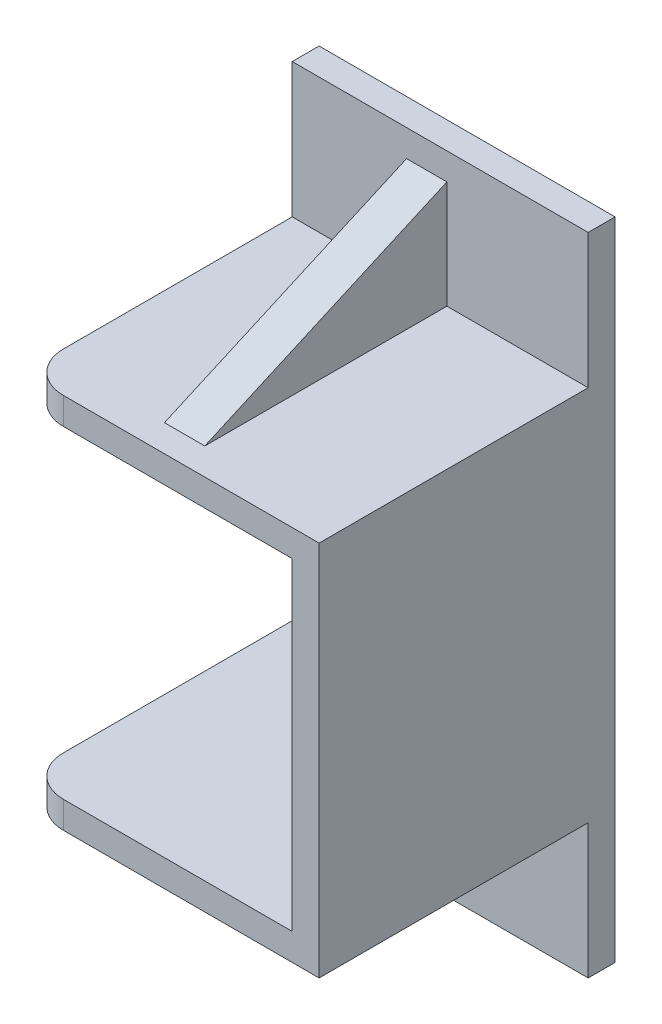
ISO-10303-21;
HEADER;
FILE_DESCRIPTION(('STEP AP214'),'2;1');
FILE_NAME('part.step','',(''),(''),'','','');
FILE_SCHEMA(('AUTOMOTIVE_DESIGN { 1 0 10303 214 1 1 1 1 }'));
ENDSEC;
DATA;
#1=APPLICATION_CONTEXT('core data for automotive mechanical design processes');
#2=APPLICATION_PROTOCOL_DEFINITION('international standard','automotive_design',2000,#1);
#3=PRODUCT_CONTEXT('',#1,'mechanical');
#4=PRODUCT('Part','Part','',(#3));
#5=PRODUCT_RELATED_PRODUCT_CATEGORY('part','',(#4));
#6=PRODUCT_DEFINITION_FORMATION('','',#4);
#7=PRODUCT_DEFINITION_CONTEXT('part definition',#1,'design');
#8=PRODUCT_DEFINITION('design','',#6,#7);
#9=PRODUCT_DEFINITION_SHAPE('','',#8);
#10=(LENGTH_UNIT() NAMED_UNIT(*) SI_UNIT(.MILLI.,.METRE.));
#11=(NAMED_UNIT(*) PLANE_ANGLE_UNIT() SI_UNIT($,.RADIAN.));
#12=(NAMED_UNIT(*) SI_UNIT($,.STERADIAN.) SOLID_ANGLE_UNIT());
#13=UNCERTAINTY_MEASURE_WITH_UNIT(LENGTH_MEASURE(1.E-05),#10,'distance_accuracy_value','');
#14=(GEOMETRIC_REPRESENTATION_CONTEXT(3) GLOBAL_UNCERTAINTY_ASSIGNED_CONTEXT((#13)) GLOBAL_UNIT_ASSIGNED_CONTEXT((#10,
#11,#12)) REPRESENTATION_CONTEXT('',''));
#15=CARTESIAN_POINT('',(0.,0.,0.));
#16=DIRECTION('',(0.,0.,1.));
#17=DIRECTION('',(1.,0.,0.));
#18=AXIS2_PLACEMENT_3D('',#15,#16,#17);
#19=CARTESIAN_POINT('',(-11.,14.,22.));
#20=DIRECTION('',(0.,-1.,0.));
#21=DIRECTION('',(0.,0.,-1.));
#22=AXIS2_PLACEMENT_3D('',#19,#20,#21);
#23=PLANE('',#22);
#24=DIRECTION('',(0.,0.,-1.));
#25=VECTOR('',#24,1.);
#26=CARTESIAN_POINT('',(-11.,14.,22.));
#27=LINE('',#26,#25);
#28=CARTESIAN_POINT('',(-11.,14.,19.));
#29=VERTEX_POINT('',#28);
#30=CARTESIAN_POINT('',(-11.,14.,2.));
#31=VERTEX_POINT('',#30);
#32=EDGE_CURVE('E352',#29,#31,#27,.T.);
#33=ORIENTED_EDGE('',*,*,#32,.F.);
#34=CARTESIAN_POINT('',(-8.,14.,19.));
#35=DIRECTION('',(0.,-1.,0.));
#36=DIRECTION('',(0.,0.,-1.));
#37=AXIS2_PLACEMENT_3D('',#34,#35,#36);
#38=CIRCLE('',#37,3.);
#39=CARTESIAN_POINT('',(-8.,14.,22.));
#40=VERTEX_POINT('',#39);
#41=EDGE_CURVE('E11',#29,#40,#38,.F.);
#42=ORIENTED_EDGE('',*,*,#41,.T.);
#43=DIRECTION('',(-1.,0.,0.));
#44=VECTOR('',#43,1.);
#45=CARTESIAN_POINT('',(-11.,14.,22.));
#46=LINE('',#45,#44);
#47=CARTESIAN_POINT('',(11.,14.,22.));
#48=VERTEX_POINT('',#47);
#49=EDGE_CURVE('E337',#48,#40,#46,.T.);
#50=ORIENTED_EDGE('',*,*,#49,.F.);
#51=DIRECTION('',(0.,0.,-1.));
#52=VECTOR('',#51,1.);
#53=CARTESIAN_POINT('',(11.,14.,22.));
#54=LINE('',#53,#52);
#55=CARTESIAN_POINT('',(11.,14.,2.));
#56=VERTEX_POINT('',#55);
#57=EDGE_CURVE('E354',#48,#56,#54,.T.);
#58=ORIENTED_EDGE('',*,*,#57,.T.);
#59=DIRECTION('',(1.,0.,0.));
#60=VECTOR('',#59,1.);
#61=CARTESIAN_POINT('',(11.,14.,2.));
#62=LINE('',#61,#60);
#63=CARTESIAN_POINT('',(0.499999999999992,14.,2.));
#64=VERTEX_POINT('',#63);
#65=EDGE_CURVE('E205',#64,#56,#62,.T.);
#66=ORIENTED_EDGE('',*,*,#65,.F.);
#67=DIRECTION('',(0.,0.,1.));
#68=VECTOR('',#67,1.);
#69=CARTESIAN_POINT('',(0.499999999999994,14.,22.));
#70=LINE('',#69,#68);
#71=CARTESIAN_POINT('',(0.499999999999995,14.,20.));
#72=VERTEX_POINT('',#71);
#73=EDGE_CURVE('E225',#64,#72,#70,.T.);
#74=ORIENTED_EDGE('',*,*,#73,.T.);
#75=DIRECTION('',(1.,0.,0.));
#76=VECTOR('',#75,1.);
#77=CARTESIAN_POINT('',(-11.,14.,20.));
#78=LINE('',#77,#76);
#79=CARTESIAN_POINT('',(-2.50000000000001,14.,20.));
#80=VERTEX_POINT('',#79);
#81=EDGE_CURVE('E210',#72,#80,#78,.F.);
#82=ORIENTED_EDGE('',*,*,#81,.T.);
#83=DIRECTION('',(0.,0.,1.));
#84=VECTOR('',#83,1.);
#85=CARTESIAN_POINT('',(-2.50000000000001,14.,22.));
#86=LINE('',#85,#84);
#87=CARTESIAN_POINT('',(-2.50000000000001,14.,2.));
#88=VERTEX_POINT('',#87);
#89=EDGE_CURVE('E208',#88,#80,#86,.T.);
#90=ORIENTED_EDGE('',*,*,#89,.F.);
#91=EDGE_CURVE('E195',#31,#88,#62,.T.);
#92=ORIENTED_EDGE('',*,*,#91,.F.);
#93=EDGE_LOOP('',(#33,#42,#50,#58,#66,#74,#82,#90,#92));
#94=FACE_BOUND('',#93,.T.);
#95=ADVANCED_FACE('F36',(#94),#23,.F.);
#96=CARTESIAN_POINT('',(-11.,-14.,22.));
#97=DIRECTION('',(0.,1.,0.));
#98=DIRECTION('',(0.,0.,1.));
#99=AXIS2_PLACEMENT_3D('',#96,#97,#98);
#100=PLANE('',#99);
#101=DIRECTION('',(1.,0.,0.));
#102=VECTOR('',#101,1.);
#103=CARTESIAN_POINT('',(-11.,-14.,22.));
#104=LINE('',#103,#102);
#105=CARTESIAN_POINT('',(-8.,-14.,22.));
#106=VERTEX_POINT('',#105);
#107=CARTESIAN_POINT('',(11.,-14.,22.));
#108=VERTEX_POINT('',#107);
#109=EDGE_CURVE('E341',#106,#108,#104,.T.);
#110=ORIENTED_EDGE('',*,*,#109,.F.);
#111=CARTESIAN_POINT('',(-8.,-14.,19.));
#112=DIRECTION('',(0.,1.,0.));
#113=DIRECTION('',(0.,0.,1.));
#114=AXIS2_PLACEMENT_3D('',#111,#112,#113);
#115=CIRCLE('',#114,3.);
#116=CARTESIAN_POINT('',(-11.,-14.,19.));
#117=VERTEX_POINT('',#116);
#118=EDGE_CURVE('E367',#106,#117,#115,.F.);
#119=ORIENTED_EDGE('',*,*,#118,.T.);
#120=DIRECTION('',(0.,0.,-1.));
#121=VECTOR('',#120,1.);
#122=CARTESIAN_POINT('',(-11.,-14.,22.));
#123=LINE('',#122,#121);
#124=CARTESIAN_POINT('',(-11.,-14.,2.));
#125=VERTEX_POINT('',#124);
#126=EDGE_CURVE('E350',#117,#125,#123,.T.);
#127=ORIENTED_EDGE('',*,*,#126,.T.);
#128=DIRECTION('',(-1.,0.,0.));
#129=VECTOR('',#128,1.);
#130=CARTESIAN_POINT('',(-11.,-14.,2.));
#131=LINE('',#130,#129);
#132=CARTESIAN_POINT('',(-2.5,-14.,2.));
#133=VERTEX_POINT('',#132);
#134=EDGE_CURVE('E259',#133,#125,#131,.T.);
#135=ORIENTED_EDGE('',*,*,#134,.F.);
#136=DIRECTION('',(0.,0.,-1.));
#137=VECTOR('',#136,1.);
#138=CARTESIAN_POINT('',(-2.5,-14.,22.));
#139=LINE('',#138,#137);
#140=CARTESIAN_POINT('',(-2.5,-14.,20.));
#141=VERTEX_POINT('',#140);
#142=EDGE_CURVE('E237',#141,#133,#139,.T.);
#143=ORIENTED_EDGE('',*,*,#142,.F.);
#144=DIRECTION('',(1.,0.,0.));
#145=VECTOR('',#144,1.);
#146=CARTESIAN_POINT('',(-11.,-14.,20.));
#147=LINE('',#146,#145);
#148=CARTESIAN_POINT('',(0.499999999999999,-14.,20.));
#149=VERTEX_POINT('',#148);
#150=EDGE_CURVE('E244',#141,#149,#147,.T.);
#151=ORIENTED_EDGE('',*,*,#150,.T.);
#152=DIRECTION('',(0.,0.,-1.));
#153=VECTOR('',#152,1.);
#154=CARTESIAN_POINT('',(0.499999999999997,-14.,22.));
#155=LINE('',#154,#153);
#156=CARTESIAN_POINT('',(0.499999999999999,-14.,2.));
#157=VERTEX_POINT('',#156);
#158=EDGE_CURVE('E242',#149,#157,#155,.T.);
#159=ORIENTED_EDGE('',*,*,#158,.T.);
#160=CARTESIAN_POINT('',(11.,-14.,2.));
#161=VERTEX_POINT('',#160);
#162=EDGE_CURVE('E264',#161,#157,#131,.T.);
#163=ORIENTED_EDGE('',*,*,#162,.F.);
#164=DIRECTION('',(0.,0.,-1.));
#165=VECTOR('',#164,1.);
#166=CARTESIAN_POINT('',(11.,-14.,22.));
#167=LINE('',#166,#165);
#168=EDGE_CURVE('E343',#108,#161,#167,.T.);
#169=ORIENTED_EDGE('',*,*,#168,.F.);
#170=EDGE_LOOP('',(#110,#119,#127,#135,#143,#151,#159,#163,#169));
#171=FACE_BOUND('',#170,.T.);
#172=ADVANCED_FACE('F390',(#171),#100,.F.);
#173=CARTESIAN_POINT('',(-11.,14.,22.));
#174=DIRECTION('',(1.,0.,0.));
#175=DIRECTION('',(0.,1.,0.));
#176=AXIS2_PLACEMENT_3D('',#173,#174,#175);
#177=PLANE('',#176);
#178=DIRECTION('',(0.,0.,-1.));
#179=VECTOR('',#178,1.);
#180=CARTESIAN_POINT('',(-11.,12.,22.));
#181=LINE('',#180,#179);
#182=CARTESIAN_POINT('',(-11.,12.,19.));
#183=VERTEX_POINT('',#182);
#184=CARTESIAN_POINT('',(-11.,12.,2.));
#185=VERTEX_POINT('',#184);
#186=EDGE_CURVE('E286',#183,#185,#181,.T.);
#187=ORIENTED_EDGE('',*,*,#186,.F.);
#188=DIRECTION('',(0.,-1.,0.));
#189=VECTOR('',#188,1.);
#190=CARTESIAN_POINT('',(-11.,14.,19.));
#191=LINE('',#190,#189);
#192=EDGE_CURVE('E44',#183,#29,#191,.F.);
#193=ORIENTED_EDGE('',*,*,#192,.T.);
#194=ORIENTED_EDGE('',*,*,#32,.T.);
#195=DIRECTION('',(0.,-1.,0.));
#196=VECTOR('',#195,1.);
#197=CARTESIAN_POINT('',(-11.,24.,2.));
#198=LINE('',#197,#196);
#199=CARTESIAN_POINT('',(-11.,24.,2.));
#200=VERTEX_POINT('',#199);
#201=EDGE_CURVE('E202',#200,#31,#198,.T.);
#202=ORIENTED_EDGE('',*,*,#201,.F.);
#203=DIRECTION('',(0.,0.,1.));
#204=VECTOR('',#203,1.);
#205=CARTESIAN_POINT('',(-11.,24.,2.));
#206=LINE('',#205,#204);
#207=CARTESIAN_POINT('',(-11.,24.,0.));
#208=VERTEX_POINT('',#207);
#209=EDGE_CURVE('E204',#208,#200,#206,.T.);
#210=ORIENTED_EDGE('',*,*,#209,.F.);
#211=DIRECTION('',(0.,-1.,0.));
#212=VECTOR('',#211,1.);
#213=CARTESIAN_POINT('',(-11.,14.,0.));
#214=LINE('',#213,#212);
#215=CARTESIAN_POINT('',(-11.,7.,0.));
#216=VERTEX_POINT('',#215);
#217=EDGE_CURVE('E338',#208,#216,#214,.T.);
#218=ORIENTED_EDGE('',*,*,#217,.T.);
#219=DIRECTION('',(0.,0.,1.));
#220=VECTOR('',#219,1.);
#221=CARTESIAN_POINT('',(-11.,7.,0.));
#222=LINE('',#221,#220);
#223=CARTESIAN_POINT('',(-11.,7.,2.));
#224=VERTEX_POINT('',#223);
#225=EDGE_CURVE('E310',#216,#224,#222,.T.);
#226=ORIENTED_EDGE('',*,*,#225,.T.);
#227=DIRECTION('',(0.,-1.,0.));
#228=VECTOR('',#227,1.);
#229=CARTESIAN_POINT('',(-11.,12.,2.));
#230=LINE('',#229,#228);
#231=EDGE_CURVE('E280',#185,#224,#230,.T.);
#232=ORIENTED_EDGE('',*,*,#231,.F.);
#233=EDGE_LOOP('',(#187,#193,#194,#202,#210,#218,#226,#232));
#234=FACE_BOUND('',#233,.T.);
#235=ADVANCED_FACE('F421',(#234),#177,.F.);
#236=CARTESIAN_POINT('',(0.,0.,2.));
#237=DIRECTION('',(0.,0.,-1.));
#238=DIRECTION('',(-1.,0.,0.));
#239=AXIS2_PLACEMENT_3D('',#236,#237,#238);
#240=PLANE('',#239);
#241=DIRECTION('',(-1.,0.,0.));
#242=VECTOR('',#241,1.);
#243=CARTESIAN_POINT('',(9.,12.,2.));
#244=LINE('',#243,#242);
#245=CARTESIAN_POINT('',(9.,12.,2.));
#246=VERTEX_POINT('',#245);
#247=EDGE_CURVE('E320',#246,#185,#244,.T.);
#248=ORIENTED_EDGE('',*,*,#247,.T.);
#249=ORIENTED_EDGE('',*,*,#231,.T.);
#250=DIRECTION('',(-1.,0.,0.));
#251=VECTOR('',#250,1.);
#252=CARTESIAN_POINT('',(-11.,7.,2.));
#253=LINE('',#252,#251);
#254=CARTESIAN_POINT('',(3.,7.,2.));
#255=VERTEX_POINT('',#254);
#256=EDGE_CURVE('E300',#255,#224,#253,.T.);
#257=ORIENTED_EDGE('',*,*,#256,.F.);
#258=DIRECTION('',(0.,1.,0.));
#259=VECTOR('',#258,1.);
#260=CARTESIAN_POINT('',(3.,7.,2.));
#261=LINE('',#260,#259);
#262=CARTESIAN_POINT('',(3.,-7.,2.));
#263=VERTEX_POINT('',#262);
#264=EDGE_CURVE('E288',#263,#255,#261,.T.);
#265=ORIENTED_EDGE('',*,*,#264,.F.);
#266=DIRECTION('',(1.,0.,0.));
#267=VECTOR('',#266,1.);
#268=CARTESIAN_POINT('',(-11.,-7.,2.));
#269=LINE('',#268,#267);
#270=CARTESIAN_POINT('',(-11.,-7.,2.));
#271=VERTEX_POINT('',#270);
#272=EDGE_CURVE('E293',#271,#263,#269,.T.);
#273=ORIENTED_EDGE('',*,*,#272,.F.);
#274=CARTESIAN_POINT('',(-11.,-12.,2.));
#275=VERTEX_POINT('',#274);
#276=EDGE_CURVE('E279',#271,#275,#230,.T.);
#277=ORIENTED_EDGE('',*,*,#276,.T.);
#278=DIRECTION('',(1.,0.,0.));
#279=VECTOR('',#278,1.);
#280=CARTESIAN_POINT('',(9.,-12.,2.));
#281=LINE('',#280,#279);
#282=CARTESIAN_POINT('',(9.,-12.,2.));
#283=VERTEX_POINT('',#282);
#284=EDGE_CURVE('E314',#275,#283,#281,.T.);
#285=ORIENTED_EDGE('',*,*,#284,.T.);
#286=DIRECTION('',(0.,1.,0.));
#287=VECTOR('',#286,1.);
#288=CARTESIAN_POINT('',(9.,12.,2.));
#289=LINE('',#288,#287);
#290=EDGE_CURVE('E316',#283,#246,#289,.T.);
#291=ORIENTED_EDGE('',*,*,#290,.T.);
#292=EDGE_LOOP('',(#248,#249,#257,#265,#273,#277,#285,#291));
#293=FACE_BOUND('',#292,.T.);
#294=ADVANCED_FACE('F440',(#293),#240,.F.);
#295=CARTESIAN_POINT('',(11.,14.,22.));
#296=DIRECTION('',(-1.,0.,0.));
#297=DIRECTION('',(0.,-1.,0.));
#298=AXIS2_PLACEMENT_3D('',#295,#296,#297);
#299=PLANE('',#298);
#300=DIRECTION('',(0.,1.,0.));
#301=VECTOR('',#300,1.);
#302=CARTESIAN_POINT('',(11.,14.,0.));
#303=LINE('',#302,#301);
#304=CARTESIAN_POINT('',(11.,-24.,0.));
#305=VERTEX_POINT('',#304);
#306=CARTESIAN_POINT('',(11.,24.,0.));
#307=VERTEX_POINT('',#306);
#308=EDGE_CURVE('E331',#305,#307,#303,.T.);
#309=ORIENTED_EDGE('',*,*,#308,.T.);
#310=DIRECTION('',(0.,0.,-1.));
#311=VECTOR('',#310,1.);
#312=CARTESIAN_POINT('',(11.,24.,2.));
#313=LINE('',#312,#311);
#314=CARTESIAN_POINT('',(11.,24.,2.));
#315=VERTEX_POINT('',#314);
#316=EDGE_CURVE('E250',#315,#307,#313,.T.);
#317=ORIENTED_EDGE('',*,*,#316,.F.);
#318=DIRECTION('',(0.,-1.,0.));
#319=VECTOR('',#318,1.);
#320=CARTESIAN_POINT('',(11.,24.,2.));
#321=LINE('',#320,#319);
#322=EDGE_CURVE('E254',#315,#56,#321,.T.);
#323=ORIENTED_EDGE('',*,*,#322,.T.);
#324=ORIENTED_EDGE('',*,*,#57,.F.);
#325=DIRECTION('',(0.,1.,0.));
#326=VECTOR('',#325,1.);
#327=CARTESIAN_POINT('',(11.,14.,22.));
#328=LINE('',#327,#326);
#329=EDGE_CURVE('E334',#108,#48,#328,.T.);
#330=ORIENTED_EDGE('',*,*,#329,.F.);
#331=ORIENTED_EDGE('',*,*,#168,.T.);
#332=DIRECTION('',(0.,1.,0.));
#333=VECTOR('',#332,1.);
#334=CARTESIAN_POINT('',(11.,-24.,2.));
#335=LINE('',#334,#333);
#336=CARTESIAN_POINT('',(11.,-24.,2.));
#337=VERTEX_POINT('',#336);
#338=EDGE_CURVE('E276',#337,#161,#335,.T.);
#339=ORIENTED_EDGE('',*,*,#338,.F.);
#340=DIRECTION('',(0.,0.,1.));
#341=VECTOR('',#340,1.);
#342=CARTESIAN_POINT('',(11.,-24.,2.));
#343=LINE('',#342,#341);
#344=EDGE_CURVE('E260',#305,#337,#343,.T.);
#345=ORIENTED_EDGE('',*,*,#344,.F.);
#346=EDGE_LOOP('',(#309,#317,#323,#324,#330,#331,#339,#345));
#347=FACE_BOUND('',#346,.T.);
#348=ADVANCED_FACE('F415',(#347),#299,.F.);
#349=ORIENTED_EDGE('',*,*,#126,.F.);
#350=DIRECTION('',(0.,-1.,0.));
#351=VECTOR('',#350,1.);
#352=CARTESIAN_POINT('',(-11.,-12.,19.));
#353=LINE('',#352,#351);
#354=CARTESIAN_POINT('',(-11.,-12.,19.));
#355=VERTEX_POINT('',#354);
#356=EDGE_CURVE('E369',#117,#355,#353,.F.);
#357=ORIENTED_EDGE('',*,*,#356,.T.);
#358=DIRECTION('',(0.,0.,1.));
#359=VECTOR('',#358,1.);
#360=CARTESIAN_POINT('',(-11.,-12.,22.));
#361=LINE('',#360,#359);
#362=EDGE_CURVE('E283',#275,#355,#361,.T.);
#363=ORIENTED_EDGE('',*,*,#362,.F.);
#364=ORIENTED_EDGE('',*,*,#276,.F.);
#365=DIRECTION('',(0.,0.,1.));
#366=VECTOR('',#365,1.);
#367=CARTESIAN_POINT('',(-11.,-7.,0.));
#368=LINE('',#367,#366);
#369=CARTESIAN_POINT('',(-11.,-7.,0.));
#370=VERTEX_POINT('',#369);
#371=EDGE_CURVE('E307',#370,#271,#368,.T.);
#372=ORIENTED_EDGE('',*,*,#371,.F.);
#373=CARTESIAN_POINT('',(-11.,-24.,0.));
#374=VERTEX_POINT('',#373);
#375=EDGE_CURVE('E345',#370,#374,#214,.T.);
#376=ORIENTED_EDGE('',*,*,#375,.T.);
#377=DIRECTION('',(0.,0.,-1.));
#378=VECTOR('',#377,1.);
#379=CARTESIAN_POINT('',(-11.,-24.,2.));
#380=LINE('',#379,#378);
#381=CARTESIAN_POINT('',(-11.,-24.,2.));
#382=VERTEX_POINT('',#381);
#383=EDGE_CURVE('E266',#382,#374,#380,.T.);
#384=ORIENTED_EDGE('',*,*,#383,.F.);
#385=DIRECTION('',(0.,1.,0.));
#386=VECTOR('',#385,1.);
#387=CARTESIAN_POINT('',(-11.,-24.,2.));
#388=LINE('',#387,#386);
#389=EDGE_CURVE('E271',#382,#125,#388,.T.);
#390=ORIENTED_EDGE('',*,*,#389,.T.);
#391=EDGE_LOOP('',(#349,#357,#363,#364,#372,#376,#384,#390));
#392=FACE_BOUND('',#391,.T.);
#393=ADVANCED_FACE('F395',(#392),#177,.F.);
#394=CARTESIAN_POINT('',(0.,0.,22.));
#395=DIRECTION('',(0.,0.,1.));
#396=DIRECTION('',(1.,0.,0.));
#397=AXIS2_PLACEMENT_3D('',#394,#395,#396);
#398=PLANE('',#397);
#399=DIRECTION('',(1.,0.,0.));
#400=VECTOR('',#399,1.);
#401=CARTESIAN_POINT('',(9.,-12.,22.));
#402=LINE('',#401,#400);
#403=CARTESIAN_POINT('',(-8.,-12.,22.));
#404=VERTEX_POINT('',#403);
#405=CARTESIAN_POINT('',(9.,-12.,22.));
#406=VERTEX_POINT('',#405);
#407=EDGE_CURVE('E306',#404,#406,#402,.T.);
#408=ORIENTED_EDGE('',*,*,#407,.F.);
#409=DIRECTION('',(0.,-1.,0.));
#410=VECTOR('',#409,1.);
#411=CARTESIAN_POINT('',(-8.,-14.,22.));
#412=LINE('',#411,#410);
#413=EDGE_CURVE('E364',#404,#106,#412,.T.);
#414=ORIENTED_EDGE('',*,*,#413,.T.);
#415=ORIENTED_EDGE('',*,*,#109,.T.);
#416=ORIENTED_EDGE('',*,*,#329,.T.);
#417=ORIENTED_EDGE('',*,*,#49,.T.);
#418=DIRECTION('',(0.,-1.,0.));
#419=VECTOR('',#418,1.);
#420=CARTESIAN_POINT('',(-8.,12.,22.));
#421=LINE('',#420,#419);
#422=CARTESIAN_POINT('',(-8.,12.,22.));
#423=VERTEX_POINT('',#422);
#424=EDGE_CURVE('E361',#40,#423,#421,.T.);
#425=ORIENTED_EDGE('',*,*,#424,.T.);
#426=DIRECTION('',(-1.,0.,0.));
#427=VECTOR('',#426,1.);
#428=CARTESIAN_POINT('',(9.,12.,22.));
#429=LINE('',#428,#427);
#430=CARTESIAN_POINT('',(9.,12.,22.));
#431=VERTEX_POINT('',#430);
#432=EDGE_CURVE('E317',#431,#423,#429,.T.);
#433=ORIENTED_EDGE('',*,*,#432,.F.);
#434=DIRECTION('',(0.,1.,0.));
#435=VECTOR('',#434,1.);
#436=CARTESIAN_POINT('',(9.,12.,22.));
#437=LINE('',#436,#435);
#438=EDGE_CURVE('E325',#406,#431,#437,.T.);
#439=ORIENTED_EDGE('',*,*,#438,.F.);
#440=EDGE_LOOP('',(#408,#414,#415,#416,#417,#425,#433,#439));
#441=FACE_BOUND('',#440,.T.);
#442=ADVANCED_FACE('F384',(#441),#398,.T.);
#443=CARTESIAN_POINT('',(0.,0.,0.));
#444=DIRECTION('',(0.,0.,1.));
#445=DIRECTION('',(1.,0.,0.));
#446=AXIS2_PLACEMENT_3D('',#443,#444,#445);
#447=PLANE('',#446);
#448=ORIENTED_EDGE('',*,*,#308,.F.);
#449=DIRECTION('',(1.,0.,0.));
#450=VECTOR('',#449,1.);
#451=CARTESIAN_POINT('',(-11.,-24.,0.));
#452=LINE('',#451,#450);
#453=EDGE_CURVE('E269',#374,#305,#452,.T.);
#454=ORIENTED_EDGE('',*,*,#453,.F.);
#455=ORIENTED_EDGE('',*,*,#375,.F.);
#456=DIRECTION('',(1.,0.,0.));
#457=VECTOR('',#456,1.);
#458=CARTESIAN_POINT('',(-11.,-7.,0.));
#459=LINE('',#458,#457);
#460=CARTESIAN_POINT('',(3.,-7.,0.));
#461=VERTEX_POINT('',#460);
#462=EDGE_CURVE('E295',#370,#461,#459,.T.);
#463=ORIENTED_EDGE('',*,*,#462,.T.);
#464=DIRECTION('',(0.,1.,0.));
#465=VECTOR('',#464,1.);
#466=CARTESIAN_POINT('',(3.,7.,0.));
#467=LINE('',#466,#465);
#468=CARTESIAN_POINT('',(3.,7.,0.));
#469=VERTEX_POINT('',#468);
#470=EDGE_CURVE('E289',#461,#469,#467,.T.);
#471=ORIENTED_EDGE('',*,*,#470,.T.);
#472=DIRECTION('',(-1.,0.,0.));
#473=VECTOR('',#472,1.);
#474=CARTESIAN_POINT('',(-11.,7.,0.));
#475=LINE('',#474,#473);
#476=EDGE_CURVE('E292',#469,#216,#475,.T.);
#477=ORIENTED_EDGE('',*,*,#476,.T.);
#478=ORIENTED_EDGE('',*,*,#217,.F.);
#479=DIRECTION('',(-1.,0.,0.));
#480=VECTOR('',#479,1.);
#481=CARTESIAN_POINT('',(11.,24.,0.));
#482=LINE('',#481,#480);
#483=EDGE_CURVE('E253',#307,#208,#482,.T.);
#484=ORIENTED_EDGE('',*,*,#483,.F.);
#485=EDGE_LOOP('',(#448,#454,#455,#463,#471,#477,#478,#484));
#486=FACE_BOUND('',#485,.T.);
#487=ADVANCED_FACE('F431',(#486),#447,.F.);
#488=CARTESIAN_POINT('',(9.,12.,2.));
#489=DIRECTION('',(0.,1.,0.));
#490=DIRECTION('',(-1.,0.,0.));
#491=AXIS2_PLACEMENT_3D('',#488,#489,#490);
#492=PLANE('',#491);
#493=ORIENTED_EDGE('',*,*,#432,.T.);
#494=CARTESIAN_POINT('',(-8.,12.,19.));
#495=DIRECTION('',(0.,1.,0.));
#496=DIRECTION('',(-1.,0.,0.));
#497=AXIS2_PLACEMENT_3D('',#494,#495,#496);
#498=CIRCLE('',#497,3.);
#499=EDGE_CURVE('E58',#423,#183,#498,.F.);
#500=ORIENTED_EDGE('',*,*,#499,.T.);
#501=ORIENTED_EDGE('',*,*,#186,.T.);
#502=ORIENTED_EDGE('',*,*,#247,.F.);
#503=DIRECTION('',(0.,0.,1.));
#504=VECTOR('',#503,1.);
#505=CARTESIAN_POINT('',(9.,12.,2.));
#506=LINE('',#505,#504);
#507=EDGE_CURVE('E329',#246,#431,#506,.T.);
#508=ORIENTED_EDGE('',*,*,#507,.T.);
#509=EDGE_LOOP('',(#493,#500,#501,#502,#508));
#510=FACE_BOUND('',#509,.T.);
#511=ADVANCED_FACE('F444',(#510),#492,.F.);
#512=CARTESIAN_POINT('',(9.,12.,2.));
#513=DIRECTION('',(1.,0.,0.));
#514=DIRECTION('',(0.,1.,0.));
#515=AXIS2_PLACEMENT_3D('',#512,#513,#514);
#516=PLANE('',#515);
#517=ORIENTED_EDGE('',*,*,#438,.T.);
#518=ORIENTED_EDGE('',*,*,#507,.F.);
#519=ORIENTED_EDGE('',*,*,#290,.F.);
#520=DIRECTION('',(0.,0.,1.));
#521=VECTOR('',#520,1.);
#522=CARTESIAN_POINT('',(9.,-12.,2.));
#523=LINE('',#522,#521);
#524=EDGE_CURVE('E323',#283,#406,#523,.T.);
#525=ORIENTED_EDGE('',*,*,#524,.T.);
#526=EDGE_LOOP('',(#517,#518,#519,#525));
#527=FACE_BOUND('',#526,.T.);
#528=ADVANCED_FACE('F446',(#527),#516,.F.);
#529=CARTESIAN_POINT('',(9.,-12.,2.));
#530=DIRECTION('',(0.,-1.,0.));
#531=DIRECTION('',(0.,0.,-1.));
#532=AXIS2_PLACEMENT_3D('',#529,#530,#531);
#533=PLANE('',#532);
#534=ORIENTED_EDGE('',*,*,#362,.T.);
#535=CARTESIAN_POINT('',(-8.,-12.,19.));
#536=DIRECTION('',(0.,-1.,0.));
#537=DIRECTION('',(0.,0.,-1.));
#538=AXIS2_PLACEMENT_3D('',#535,#536,#537);
#539=CIRCLE('',#538,3.);
#540=EDGE_CURVE('E371',#355,#404,#539,.F.);
#541=ORIENTED_EDGE('',*,*,#540,.T.);
#542=ORIENTED_EDGE('',*,*,#407,.T.);
#543=ORIENTED_EDGE('',*,*,#524,.F.);
#544=ORIENTED_EDGE('',*,*,#284,.F.);
#545=EDGE_LOOP('',(#534,#541,#542,#543,#544));
#546=FACE_BOUND('',#545,.T.);
#547=ADVANCED_FACE('F376',(#546),#533,.F.);
#548=CARTESIAN_POINT('',(3.,7.,0.));
#549=DIRECTION('',(1.,0.,0.));
#550=DIRECTION('',(0.,1.,0.));
#551=AXIS2_PLACEMENT_3D('',#548,#549,#550);
#552=PLANE('',#551);
#553=ORIENTED_EDGE('',*,*,#264,.T.);
#554=DIRECTION('',(0.,0.,1.));
#555=VECTOR('',#554,1.);
#556=CARTESIAN_POINT('',(3.,7.,0.));
#557=LINE('',#556,#555);
#558=EDGE_CURVE('E297',#469,#255,#557,.T.);
#559=ORIENTED_EDGE('',*,*,#558,.F.);
#560=ORIENTED_EDGE('',*,*,#470,.F.);
#561=DIRECTION('',(0.,0.,1.));
#562=VECTOR('',#561,1.);
#563=CARTESIAN_POINT('',(3.,-7.,0.));
#564=LINE('',#563,#562);
#565=EDGE_CURVE('E303',#461,#263,#564,.T.);
#566=ORIENTED_EDGE('',*,*,#565,.T.);
#567=EDGE_LOOP('',(#553,#559,#560,#566));
#568=FACE_BOUND('',#567,.T.);
#569=ADVANCED_FACE('F547',(#568),#552,.F.);
#570=CARTESIAN_POINT('',(-11.,-7.,0.));
#571=DIRECTION('',(0.,-1.,0.));
#572=DIRECTION('',(0.,0.,-1.));
#573=AXIS2_PLACEMENT_3D('',#570,#571,#572);
#574=PLANE('',#573);
#575=ORIENTED_EDGE('',*,*,#565,.F.);
#576=ORIENTED_EDGE('',*,*,#462,.F.);
#577=ORIENTED_EDGE('',*,*,#371,.T.);
#578=ORIENTED_EDGE('',*,*,#272,.T.);
#579=EDGE_LOOP('',(#575,#576,#577,#578));
#580=FACE_BOUND('',#579,.T.);
#581=ADVANCED_FACE('F453',(#580),#574,.F.);
#582=CARTESIAN_POINT('',(-11.,7.,0.));
#583=DIRECTION('',(0.,1.,0.));
#584=DIRECTION('',(0.,0.,1.));
#585=AXIS2_PLACEMENT_3D('',#582,#583,#584);
#586=PLANE('',#585);
#587=ORIENTED_EDGE('',*,*,#256,.T.);
#588=ORIENTED_EDGE('',*,*,#225,.F.);
#589=ORIENTED_EDGE('',*,*,#476,.F.);
#590=ORIENTED_EDGE('',*,*,#558,.T.);
#591=EDGE_LOOP('',(#587,#588,#589,#590));
#592=FACE_BOUND('',#591,.T.);
#593=ADVANCED_FACE('F436',(#592),#586,.F.);
#594=CARTESIAN_POINT('',(-11.,-24.,2.));
#595=DIRECTION('',(0.,0.,-1.));
#596=DIRECTION('',(-1.,0.,0.));
#597=AXIS2_PLACEMENT_3D('',#594,#595,#596);
#598=PLANE('',#597);
#599=DIRECTION('',(0.,-1.,0.));
#600=VECTOR('',#599,1.);
#601=CARTESIAN_POINT('',(0.499999999999999,-24.,2.));
#602=LINE('',#601,#600);
#603=CARTESIAN_POINT('',(0.499999999999999,-22.,2.));
#604=VERTEX_POINT('',#603);
#605=EDGE_CURVE('E240',#157,#604,#602,.T.);
#606=ORIENTED_EDGE('',*,*,#605,.T.);
#607=DIRECTION('',(-1.,0.,0.));
#608=VECTOR('',#607,1.);
#609=CARTESIAN_POINT('',(-11.,-22.,2.));
#610=LINE('',#609,#608);
#611=CARTESIAN_POINT('',(-2.5,-22.,2.));
#612=VERTEX_POINT('',#611);
#613=EDGE_CURVE('E357',#604,#612,#610,.T.);
#614=ORIENTED_EDGE('',*,*,#613,.T.);
#615=DIRECTION('',(0.,-1.,0.));
#616=VECTOR('',#615,1.);
#617=CARTESIAN_POINT('',(-2.5,-24.,2.));
#618=LINE('',#617,#616);
#619=EDGE_CURVE('E232',#133,#612,#618,.T.);
#620=ORIENTED_EDGE('',*,*,#619,.F.);
#621=ORIENTED_EDGE('',*,*,#134,.T.);
#622=ORIENTED_EDGE('',*,*,#389,.F.);
#623=DIRECTION('',(-1.,0.,0.));
#624=VECTOR('',#623,1.);
#625=CARTESIAN_POINT('',(-11.,-24.,2.));
#626=LINE('',#625,#624);
#627=EDGE_CURVE('E263',#337,#382,#626,.T.);
#628=ORIENTED_EDGE('',*,*,#627,.F.);
#629=ORIENTED_EDGE('',*,*,#338,.T.);
#630=ORIENTED_EDGE('',*,*,#162,.T.);
#631=EDGE_LOOP('',(#606,#614,#620,#621,#622,#628,#629,#630));
#632=FACE_BOUND('',#631,.T.);
#633=ADVANCED_FACE('F399',(#632),#598,.F.);
#634=CARTESIAN_POINT('',(0.,-24.,0.));
#635=DIRECTION('',(0.,-1.,0.));
#636=DIRECTION('',(0.,0.,-1.));
#637=AXIS2_PLACEMENT_3D('',#634,#635,#636);
#638=PLANE('',#637);
#639=ORIENTED_EDGE('',*,*,#627,.T.);
#640=ORIENTED_EDGE('',*,*,#383,.T.);
#641=ORIENTED_EDGE('',*,*,#453,.T.);
#642=ORIENTED_EDGE('',*,*,#344,.T.);
#643=EDGE_LOOP('',(#639,#640,#641,#642));
#644=FACE_BOUND('',#643,.T.);
#645=ADVANCED_FACE('F456',(#644),#638,.T.);
#646=CARTESIAN_POINT('',(11.,24.,2.));
#647=DIRECTION('',(0.,0.,-1.));
#648=DIRECTION('',(-1.,0.,0.));
#649=AXIS2_PLACEMENT_3D('',#646,#647,#648);
#650=PLANE('',#649);
#651=DIRECTION('',(-1.,0.,0.));
#652=VECTOR('',#651,1.);
#653=CARTESIAN_POINT('',(11.,22.,2.));
#654=LINE('',#653,#652);
#655=CARTESIAN_POINT('',(-2.50000000000001,22.,2.));
#656=VERTEX_POINT('',#655);
#657=CARTESIAN_POINT('',(0.499999999999995,22.,2.));
#658=VERTEX_POINT('',#657);
#659=EDGE_CURVE('E359',#656,#658,#654,.F.);
#660=ORIENTED_EDGE('',*,*,#659,.T.);
#661=DIRECTION('',(0.,-1.,0.));
#662=VECTOR('',#661,1.);
#663=CARTESIAN_POINT('',(0.499999999999992,24.,2.));
#664=LINE('',#663,#662);
#665=EDGE_CURVE('E214',#658,#64,#664,.T.);
#666=ORIENTED_EDGE('',*,*,#665,.T.);
#667=ORIENTED_EDGE('',*,*,#65,.T.);
#668=ORIENTED_EDGE('',*,*,#322,.F.);
#669=DIRECTION('',(1.,0.,0.));
#670=VECTOR('',#669,1.);
#671=CARTESIAN_POINT('',(11.,24.,2.));
#672=LINE('',#671,#670);
#673=EDGE_CURVE('E248',#200,#315,#672,.T.);
#674=ORIENTED_EDGE('',*,*,#673,.F.);
#675=ORIENTED_EDGE('',*,*,#201,.T.);
#676=ORIENTED_EDGE('',*,*,#91,.T.);
#677=DIRECTION('',(0.,-1.,0.));
#678=VECTOR('',#677,1.);
#679=CARTESIAN_POINT('',(-2.50000000000001,24.,2.));
#680=LINE('',#679,#678);
#681=EDGE_CURVE('E199',#656,#88,#680,.T.);
#682=ORIENTED_EDGE('',*,*,#681,.F.);
#683=EDGE_LOOP('',(#660,#666,#667,#668,#674,#675,#676,#682));
#684=FACE_BOUND('',#683,.T.);
#685=ADVANCED_FACE('F197',(#684),#650,.F.);
#686=CARTESIAN_POINT('',(0.,24.,0.));
#687=DIRECTION('',(0.,1.,0.));
#688=DIRECTION('',(0.,0.,1.));
#689=AXIS2_PLACEMENT_3D('',#686,#687,#688);
#690=PLANE('',#689);
#691=ORIENTED_EDGE('',*,*,#483,.T.);
#692=ORIENTED_EDGE('',*,*,#209,.T.);
#693=ORIENTED_EDGE('',*,*,#673,.T.);
#694=ORIENTED_EDGE('',*,*,#316,.T.);
#695=EDGE_LOOP('',(#691,#692,#693,#694));
#696=FACE_BOUND('',#695,.T.);
#697=ADVANCED_FACE('F425',(#696),#690,.T.);
#698=CARTESIAN_POINT('',(-1.,-14.,20.));
#699=DIRECTION('',(0.,-0.913811548620257,0.406138466053448));
#700=DIRECTION('',(0.,-0.406138466053448,-0.913811548620257));
#701=AXIS2_PLACEMENT_3D('',#698,#699,#700);
#702=PLANE('',#701);
#703=ORIENTED_EDGE('',*,*,#150,.F.);
#704=DIRECTION('',(0.,-0.406138466053448,-0.913811548620257));
#705=VECTOR('',#704,1.);
#706=CARTESIAN_POINT('',(-2.5,-14.,20.));
#707=LINE('',#706,#705);
#708=EDGE_CURVE('E228',#141,#612,#707,.T.);
#709=ORIENTED_EDGE('',*,*,#708,.T.);
#710=ORIENTED_EDGE('',*,*,#613,.F.);
#711=DIRECTION('',(0.,-0.406138466053448,-0.913811548620257));
#712=VECTOR('',#711,1.);
#713=CARTESIAN_POINT('',(0.499999999999997,-14.,20.));
#714=LINE('',#713,#712);
#715=EDGE_CURVE('E229',#149,#604,#714,.T.);
#716=ORIENTED_EDGE('',*,*,#715,.F.);
#717=EDGE_LOOP('',(#703,#709,#710,#716));
#718=FACE_BOUND('',#717,.T.);
#719=ADVANCED_FACE('F406',(#718),#702,.T.);
#720=CARTESIAN_POINT('',(0.499999999999996,0.,11.));
#721=DIRECTION('',(1.,0.,0.));
#722=DIRECTION('',(0.,1.,0.));
#723=AXIS2_PLACEMENT_3D('',#720,#721,#722);
#724=PLANE('',#723);
#725=ORIENTED_EDGE('',*,*,#605,.F.);
#726=ORIENTED_EDGE('',*,*,#158,.F.);
#727=ORIENTED_EDGE('',*,*,#715,.T.);
#728=EDGE_LOOP('',(#725,#726,#727));
#729=FACE_BOUND('',#728,.T.);
#730=ADVANCED_FACE('F411',(#729),#724,.T.);
#731=CARTESIAN_POINT('',(-2.5,0.,11.));
#732=DIRECTION('',(1.,0.,0.));
#733=DIRECTION('',(0.,1.,0.));
#734=AXIS2_PLACEMENT_3D('',#731,#732,#733);
#735=PLANE('',#734);
#736=ORIENTED_EDGE('',*,*,#708,.F.);
#737=ORIENTED_EDGE('',*,*,#142,.T.);
#738=ORIENTED_EDGE('',*,*,#619,.T.);
#739=EDGE_LOOP('',(#736,#737,#738));
#740=FACE_BOUND('',#739,.T.);
#741=ADVANCED_FACE('F403',(#740),#735,.F.);
#742=CARTESIAN_POINT('',(-1.00000000000001,14.,20.));
#743=DIRECTION('',(0.,-0.913811548620257,-0.406138466053448));
#744=DIRECTION('',(0.,0.406138466053448,-0.913811548620257));
#745=AXIS2_PLACEMENT_3D('',#742,#743,#744);
#746=PLANE('',#745);
#747=ORIENTED_EDGE('',*,*,#81,.F.);
#748=DIRECTION('',(0.,0.406138466053448,-0.913811548620257));
#749=VECTOR('',#748,1.);
#750=CARTESIAN_POINT('',(0.499999999999994,14.,20.));
#751=LINE('',#750,#749);
#752=EDGE_CURVE('E218',#72,#658,#751,.T.);
#753=ORIENTED_EDGE('',*,*,#752,.T.);
#754=ORIENTED_EDGE('',*,*,#659,.F.);
#755=DIRECTION('',(0.,0.406138466053448,-0.913811548620257));
#756=VECTOR('',#755,1.);
#757=CARTESIAN_POINT('',(-2.50000000000001,14.,20.));
#758=LINE('',#757,#756);
#759=EDGE_CURVE('E217',#80,#656,#758,.T.);
#760=ORIENTED_EDGE('',*,*,#759,.F.);
#761=EDGE_LOOP('',(#747,#753,#754,#760));
#762=FACE_BOUND('',#761,.T.);
#763=ADVANCED_FACE('F464',(#762),#746,.F.);
#764=CARTESIAN_POINT('',(0.499999999999996,0.,11.));
#765=DIRECTION('',(1.,0.,0.));
#766=DIRECTION('',(0.,1.,0.));
#767=AXIS2_PLACEMENT_3D('',#764,#765,#766);
#768=PLANE('',#767);
#769=ORIENTED_EDGE('',*,*,#752,.F.);
#770=ORIENTED_EDGE('',*,*,#73,.F.);
#771=ORIENTED_EDGE('',*,*,#665,.F.);
#772=EDGE_LOOP('',(#769,#770,#771));
#773=FACE_BOUND('',#772,.T.);
#774=ADVANCED_FACE('F462',(#773),#768,.T.);
#775=CARTESIAN_POINT('',(-2.5,0.,11.));
#776=DIRECTION('',(1.,0.,0.));
#777=DIRECTION('',(0.,1.,0.));
#778=AXIS2_PLACEMENT_3D('',#775,#776,#777);
#779=PLANE('',#778);
#780=ORIENTED_EDGE('',*,*,#681,.T.);
#781=ORIENTED_EDGE('',*,*,#89,.T.);
#782=ORIENTED_EDGE('',*,*,#759,.T.);
#783=EDGE_LOOP('',(#780,#781,#782));
#784=FACE_BOUND('',#783,.T.);
#785=ADVANCED_FACE('F216',(#784),#779,.F.);
#786=CARTESIAN_POINT('',(-8.,0.,19.));
#787=DIRECTION('',(0.,1.,0.));
#788=DIRECTION('',(-1.,0.,0.));
#789=AXIS2_PLACEMENT_3D('',#786,#787,#788);
#790=CYLINDRICAL_SURFACE('',#789,3.);
#791=ORIENTED_EDGE('',*,*,#540,.F.);
#792=ORIENTED_EDGE('',*,*,#356,.F.);
#793=ORIENTED_EDGE('',*,*,#118,.F.);
#794=ORIENTED_EDGE('',*,*,#413,.F.);
#795=EDGE_LOOP('',(#791,#792,#793,#794));
#796=FACE_BOUND('',#795,.T.);
#797=ADVANCED_FACE('F387',(#796),#790,.T.);
#798=CARTESIAN_POINT('',(-8.,0.,19.));
#799=DIRECTION('',(0.,1.,0.));
#800=DIRECTION('',(-1.,0.,0.));
#801=AXIS2_PLACEMENT_3D('',#798,#799,#800);
#802=CYLINDRICAL_SURFACE('',#801,3.);
#803=ORIENTED_EDGE('',*,*,#41,.F.);
#804=ORIENTED_EDGE('',*,*,#192,.F.);
#805=ORIENTED_EDGE('',*,*,#499,.F.);
#806=ORIENTED_EDGE('',*,*,#424,.F.);
#807=EDGE_LOOP('',(#803,#804,#805,#806));
#808=FACE_BOUND('',#807,.T.);
#809=ADVANCED_FACE('F38',(#808),#802,.T.);
#810=CLOSED_SHELL('',(#95,#172,#235,#294,#348,#393,#442,#487,#511,#528,#547,#569,#581,#593,#633,
#645,#685,#697,#719,#730,#741,#763,#774,#785,#797,#809));
#811=MANIFOLD_SOLID_BREP('B2',#810);
#812=ADVANCED_BREP_SHAPE_REPRESENTATION('',(#18,#811),#14);
#813=SHAPE_DEFINITION_REPRESENTATION(#9,#812);
ENDSEC;
END-ISO-10303-21;
